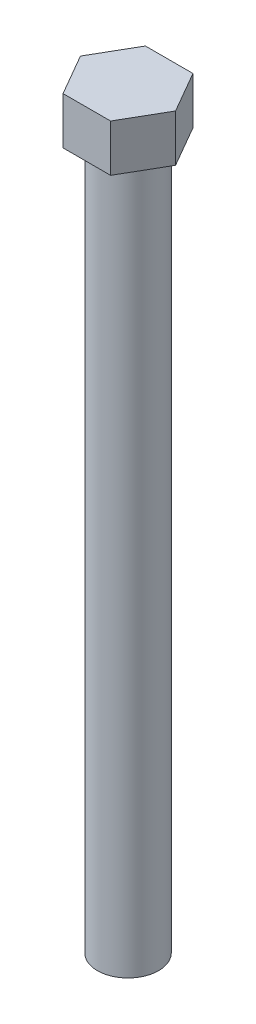
ISO-10303-21;
HEADER;
FILE_DESCRIPTION(('STEP AP214'),'2;1');
FILE_NAME('part.step','',(''),(''),'','','');
FILE_SCHEMA(('AUTOMOTIVE_DESIGN { 1 0 10303 214 1 1 1 1 }'));
ENDSEC;
DATA;
#1=APPLICATION_CONTEXT('core data for automotive mechanical design processes');
#2=APPLICATION_PROTOCOL_DEFINITION('international standard','automotive_design',2000,#1);
#3=PRODUCT_CONTEXT('',#1,'mechanical');
#4=PRODUCT('Part','Part','',(#3));
#5=PRODUCT_RELATED_PRODUCT_CATEGORY('part','',(#4));
#6=PRODUCT_DEFINITION_FORMATION('','',#4);
#7=PRODUCT_DEFINITION_CONTEXT('part definition',#1,'design');
#8=PRODUCT_DEFINITION('design','',#6,#7);
#9=PRODUCT_DEFINITION_SHAPE('','',#8);
#10=(LENGTH_UNIT() NAMED_UNIT(*) SI_UNIT(.MILLI.,.METRE.));
#11=(NAMED_UNIT(*) PLANE_ANGLE_UNIT() SI_UNIT($,.RADIAN.));
#12=(NAMED_UNIT(*) SI_UNIT($,.STERADIAN.) SOLID_ANGLE_UNIT());
#13=UNCERTAINTY_MEASURE_WITH_UNIT(LENGTH_MEASURE(1.E-05),#10,'distance_accuracy_value','');
#14=(GEOMETRIC_REPRESENTATION_CONTEXT(3) GLOBAL_UNCERTAINTY_ASSIGNED_CONTEXT((#13)) GLOBAL_UNIT_ASSIGNED_CONTEXT((#10,
#11,#12)) REPRESENTATION_CONTEXT('',''));
#15=CARTESIAN_POINT('',(0.,0.,0.));
#16=DIRECTION('',(0.,0.,1.));
#17=DIRECTION('',(1.,0.,0.));
#18=AXIS2_PLACEMENT_3D('',#15,#16,#17);
#19=CARTESIAN_POINT('',(0.,-3.,0.));
#20=DIRECTION('',(0.,1.,0.));
#21=DIRECTION('',(0.,0.,1.));
#22=AXIS2_PLACEMENT_3D('',#19,#20,#21);
#23=CYLINDRICAL_SURFACE('',#22,0.13);
#24=CARTESIAN_POINT('',(0.,-3.,0.));
#25=DIRECTION('',(0.,1.,0.));
#26=DIRECTION('',(0.,0.,1.));
#27=AXIS2_PLACEMENT_3D('',#24,#25,#26);
#28=CIRCLE('',#27,0.13);
#29=CARTESIAN_POINT('',(0.,-3.,0.13));
#30=VERTEX_POINT('',#29);
#31=EDGE_CURVE('E11',#30,#30,#28,.T.);
#32=ORIENTED_EDGE('',*,*,#31,.T.);
#33=EDGE_LOOP('',(#32));
#34=FACE_BOUND('',#33,.T.);
#35=CARTESIAN_POINT('',(0.,0.,0.));
#36=DIRECTION('',(0.,1.,0.));
#37=DIRECTION('',(0.,0.,1.));
#38=AXIS2_PLACEMENT_3D('',#35,#36,#37);
#39=CIRCLE('',#38,0.13);
#40=CARTESIAN_POINT('',(0.,0.,0.13));
#41=VERTEX_POINT('',#40);
#42=EDGE_CURVE('E36',#41,#41,#39,.T.);
#43=ORIENTED_EDGE('',*,*,#42,.F.);
#44=EDGE_LOOP('',(#43));
#45=FACE_BOUND('',#44,.T.);
#46=ADVANCED_FACE('F33',(#34,#45),#23,.T.);
#47=CARTESIAN_POINT('',(0.,-3.,0.));
#48=DIRECTION('',(0.,1.,0.));
#49=DIRECTION('',(0.,0.,1.));
#50=AXIS2_PLACEMENT_3D('',#47,#48,#49);
#51=PLANE('',#50);
#52=ORIENTED_EDGE('',*,*,#31,.F.);
#53=EDGE_LOOP('',(#52));
#54=FACE_BOUND('',#53,.T.);
#55=ADVANCED_FACE('F144',(#54),#51,.F.);
#56=CARTESIAN_POINT('',(-0.151554445662277,0.2,0.0875));
#57=DIRECTION('',(0.866025403784439,0.,-0.5));
#58=DIRECTION('',(-0.5,0.,-0.866025403784439));
#59=AXIS2_PLACEMENT_3D('',#56,#57,#58);
#60=PLANE('',#59);
#61=DIRECTION('',(0.5,0.,0.866025403784439));
#62=VECTOR('',#61,1.);
#63=CARTESIAN_POINT('',(-0.151554445662277,0.,0.0875));
#64=LINE('',#63,#62);
#65=CARTESIAN_POINT('',(-0.202072594216369,0.,0.));
#66=VERTEX_POINT('',#65);
#67=CARTESIAN_POINT('',(-0.101036297108185,0.,0.175));
#68=VERTEX_POINT('',#67);
#69=EDGE_CURVE('E118',#66,#68,#64,.T.);
#70=ORIENTED_EDGE('',*,*,#69,.T.);
#71=DIRECTION('',(0.,-1.,0.));
#72=VECTOR('',#71,1.);
#73=CARTESIAN_POINT('',(-0.101036297108185,0.2,0.175));
#74=LINE('',#73,#72);
#75=CARTESIAN_POINT('',(-0.101036297108185,0.2,0.175));
#76=VERTEX_POINT('',#75);
#77=EDGE_CURVE('E135',#76,#68,#74,.T.);
#78=ORIENTED_EDGE('',*,*,#77,.F.);
#79=DIRECTION('',(0.5,0.,0.866025403784439));
#80=VECTOR('',#79,1.);
#81=CARTESIAN_POINT('',(-0.151554445662277,0.2,0.0875));
#82=LINE('',#81,#80);
#83=CARTESIAN_POINT('',(-0.202072594216369,0.2,0.));
#84=VERTEX_POINT('',#83);
#85=EDGE_CURVE('E128',#84,#76,#82,.T.);
#86=ORIENTED_EDGE('',*,*,#85,.F.);
#87=DIRECTION('',(0.,-1.,0.));
#88=VECTOR('',#87,1.);
#89=CARTESIAN_POINT('',(-0.202072594216369,0.2,0.));
#90=LINE('',#89,#88);
#91=EDGE_CURVE('E114',#84,#66,#90,.T.);
#92=ORIENTED_EDGE('',*,*,#91,.T.);
#93=EDGE_LOOP('',(#70,#78,#86,#92));
#94=FACE_BOUND('',#93,.T.);
#95=ADVANCED_FACE('F149',(#94),#60,.F.);
#96=CARTESIAN_POINT('',(0.,0.2,0.175));
#97=DIRECTION('',(0.,0.,-1.));
#98=DIRECTION('',(-1.,0.,0.));
#99=AXIS2_PLACEMENT_3D('',#96,#97,#98);
#100=PLANE('',#99);
#101=DIRECTION('',(1.,0.,0.));
#102=VECTOR('',#101,1.);
#103=CARTESIAN_POINT('',(0.,0.,0.175));
#104=LINE('',#103,#102);
#105=CARTESIAN_POINT('',(0.101036297108185,0.,0.175));
#106=VERTEX_POINT('',#105);
#107=EDGE_CURVE('E121',#68,#106,#104,.T.);
#108=ORIENTED_EDGE('',*,*,#107,.T.);
#109=DIRECTION('',(0.,-1.,0.));
#110=VECTOR('',#109,1.);
#111=CARTESIAN_POINT('',(0.101036297108185,0.2,0.175));
#112=LINE('',#111,#110);
#113=CARTESIAN_POINT('',(0.101036297108185,0.2,0.175));
#114=VERTEX_POINT('',#113);
#115=EDGE_CURVE('E132',#114,#106,#112,.T.);
#116=ORIENTED_EDGE('',*,*,#115,.F.);
#117=DIRECTION('',(1.,0.,0.));
#118=VECTOR('',#117,1.);
#119=CARTESIAN_POINT('',(0.,0.2,0.175));
#120=LINE('',#119,#118);
#121=EDGE_CURVE('E87',#76,#114,#120,.T.);
#122=ORIENTED_EDGE('',*,*,#121,.F.);
#123=ORIENTED_EDGE('',*,*,#77,.T.);
#124=EDGE_LOOP('',(#108,#116,#122,#123));
#125=FACE_BOUND('',#124,.T.);
#126=ADVANCED_FACE('F155',(#125),#100,.F.);
#127=CARTESIAN_POINT('',(0.151554445662277,0.2,0.0875));
#128=DIRECTION('',(-0.866025403784439,0.,-0.5));
#129=DIRECTION('',(-0.5,0.,0.866025403784439));
#130=AXIS2_PLACEMENT_3D('',#127,#128,#129);
#131=PLANE('',#130);
#132=DIRECTION('',(0.5,0.,-0.866025403784439));
#133=VECTOR('',#132,1.);
#134=CARTESIAN_POINT('',(0.151554445662277,0.,0.0875));
#135=LINE('',#134,#133);
#136=CARTESIAN_POINT('',(0.202072594216369,0.,0.));
#137=VERTEX_POINT('',#136);
#138=EDGE_CURVE('E123',#106,#137,#135,.T.);
#139=ORIENTED_EDGE('',*,*,#138,.T.);
#140=DIRECTION('',(0.,-1.,0.));
#141=VECTOR('',#140,1.);
#142=CARTESIAN_POINT('',(0.202072594216369,0.2,0.));
#143=LINE('',#142,#141);
#144=CARTESIAN_POINT('',(0.202072594216369,0.2,0.));
#145=VERTEX_POINT('',#144);
#146=EDGE_CURVE('E109',#145,#137,#143,.T.);
#147=ORIENTED_EDGE('',*,*,#146,.F.);
#148=DIRECTION('',(0.5,0.,-0.866025403784439));
#149=VECTOR('',#148,1.);
#150=CARTESIAN_POINT('',(0.151554445662277,0.2,0.0875));
#151=LINE('',#150,#149);
#152=EDGE_CURVE('E100',#114,#145,#151,.T.);
#153=ORIENTED_EDGE('',*,*,#152,.F.);
#154=ORIENTED_EDGE('',*,*,#115,.T.);
#155=EDGE_LOOP('',(#139,#147,#153,#154));
#156=FACE_BOUND('',#155,.T.);
#157=ADVANCED_FACE('F161',(#156),#131,.F.);
#158=CARTESIAN_POINT('',(0.151554445662277,0.2,-0.0875));
#159=DIRECTION('',(-0.866025403784438,0.,0.5));
#160=DIRECTION('',(0.5,0.,0.866025403784438));
#161=AXIS2_PLACEMENT_3D('',#158,#159,#160);
#162=PLANE('',#161);
#163=DIRECTION('',(-0.5,0.,-0.866025403784438));
#164=VECTOR('',#163,1.);
#165=CARTESIAN_POINT('',(0.151554445662277,0.,-0.0875));
#166=LINE('',#165,#164);
#167=CARTESIAN_POINT('',(0.101036297108184,0.,-0.175));
#168=VERTEX_POINT('',#167);
#169=EDGE_CURVE('E108',#137,#168,#166,.T.);
#170=ORIENTED_EDGE('',*,*,#169,.T.);
#171=DIRECTION('',(0.,-1.,0.));
#172=VECTOR('',#171,1.);
#173=CARTESIAN_POINT('',(0.101036297108184,0.2,-0.175));
#174=LINE('',#173,#172);
#175=CARTESIAN_POINT('',(0.101036297108184,0.2,-0.175));
#176=VERTEX_POINT('',#175);
#177=EDGE_CURVE('E105',#176,#168,#174,.T.);
#178=ORIENTED_EDGE('',*,*,#177,.F.);
#179=DIRECTION('',(-0.5,0.,-0.866025403784438));
#180=VECTOR('',#179,1.);
#181=CARTESIAN_POINT('',(0.151554445662277,0.2,-0.0875));
#182=LINE('',#181,#180);
#183=EDGE_CURVE('E94',#145,#176,#182,.T.);
#184=ORIENTED_EDGE('',*,*,#183,.F.);
#185=ORIENTED_EDGE('',*,*,#146,.T.);
#186=EDGE_LOOP('',(#170,#178,#184,#185));
#187=FACE_BOUND('',#186,.T.);
#188=ADVANCED_FACE('F106',(#187),#162,.F.);
#189=CARTESIAN_POINT('',(0.,0.2,-0.175));
#190=DIRECTION('',(0.,0.,1.));
#191=DIRECTION('',(1.,0.,0.));
#192=AXIS2_PLACEMENT_3D('',#189,#190,#191);
#193=PLANE('',#192);
#194=DIRECTION('',(-1.,0.,0.));
#195=VECTOR('',#194,1.);
#196=CARTESIAN_POINT('',(0.,0.,-0.175));
#197=LINE('',#196,#195);
#198=CARTESIAN_POINT('',(-0.101036297108185,0.,-0.175));
#199=VERTEX_POINT('',#198);
#200=EDGE_CURVE('E72',#168,#199,#197,.T.);
#201=ORIENTED_EDGE('',*,*,#200,.T.);
#202=DIRECTION('',(0.,-1.,0.));
#203=VECTOR('',#202,1.);
#204=CARTESIAN_POINT('',(-0.101036297108185,0.2,-0.175));
#205=LINE('',#204,#203);
#206=CARTESIAN_POINT('',(-0.101036297108185,0.2,-0.175));
#207=VERTEX_POINT('',#206);
#208=EDGE_CURVE('E110',#207,#199,#205,.T.);
#209=ORIENTED_EDGE('',*,*,#208,.F.);
#210=DIRECTION('',(-1.,0.,0.));
#211=VECTOR('',#210,1.);
#212=CARTESIAN_POINT('',(0.,0.2,-0.175));
#213=LINE('',#212,#211);
#214=EDGE_CURVE('E98',#176,#207,#213,.T.);
#215=ORIENTED_EDGE('',*,*,#214,.F.);
#216=ORIENTED_EDGE('',*,*,#177,.T.);
#217=EDGE_LOOP('',(#201,#209,#215,#216));
#218=FACE_BOUND('',#217,.T.);
#219=ADVANCED_FACE('F112',(#218),#193,.F.);
#220=CARTESIAN_POINT('',(-0.151554445662277,0.2,-0.0875));
#221=DIRECTION('',(0.866025403784439,0.,0.5));
#222=DIRECTION('',(0.5,0.,-0.866025403784439));
#223=AXIS2_PLACEMENT_3D('',#220,#221,#222);
#224=PLANE('',#223);
#225=DIRECTION('',(-0.5,0.,0.866025403784439));
#226=VECTOR('',#225,1.);
#227=CARTESIAN_POINT('',(-0.151554445662277,0.,-0.0875));
#228=LINE('',#227,#226);
#229=EDGE_CURVE('E78',#199,#66,#228,.T.);
#230=ORIENTED_EDGE('',*,*,#229,.T.);
#231=ORIENTED_EDGE('',*,*,#91,.F.);
#232=DIRECTION('',(-0.5,0.,0.866025403784439));
#233=VECTOR('',#232,1.);
#234=CARTESIAN_POINT('',(-0.151554445662277,0.2,-0.0875));
#235=LINE('',#234,#233);
#236=EDGE_CURVE('E49',#207,#84,#235,.T.);
#237=ORIENTED_EDGE('',*,*,#236,.F.);
#238=ORIENTED_EDGE('',*,*,#208,.T.);
#239=EDGE_LOOP('',(#230,#231,#237,#238));
#240=FACE_BOUND('',#239,.T.);
#241=ADVANCED_FACE('F169',(#240),#224,.F.);
#242=CARTESIAN_POINT('',(0.,0.2,0.));
#243=DIRECTION('',(0.,1.,0.));
#244=DIRECTION('',(0.,0.,1.));
#245=AXIS2_PLACEMENT_3D('',#242,#243,#244);
#246=PLANE('',#245);
#247=ORIENTED_EDGE('',*,*,#85,.T.);
#248=ORIENTED_EDGE('',*,*,#121,.T.);
#249=ORIENTED_EDGE('',*,*,#152,.T.);
#250=ORIENTED_EDGE('',*,*,#183,.T.);
#251=ORIENTED_EDGE('',*,*,#214,.T.);
#252=ORIENTED_EDGE('',*,*,#236,.T.);
#253=EDGE_LOOP('',(#247,#248,#249,#250,#251,#252));
#254=FACE_BOUND('',#253,.T.);
#255=ADVANCED_FACE('F96',(#254),#246,.T.);
#256=CARTESIAN_POINT('',(0.,0.,0.));
#257=DIRECTION('',(0.,1.,0.));
#258=DIRECTION('',(0.,0.,1.));
#259=AXIS2_PLACEMENT_3D('',#256,#257,#258);
#260=PLANE('',#259);
#261=ORIENTED_EDGE('',*,*,#42,.T.);
#262=EDGE_LOOP('',(#261));
#263=FACE_BOUND('',#262,.T.);
#264=ORIENTED_EDGE('',*,*,#69,.F.);
#265=ORIENTED_EDGE('',*,*,#229,.F.);
#266=ORIENTED_EDGE('',*,*,#200,.F.);
#267=ORIENTED_EDGE('',*,*,#169,.F.);
#268=ORIENTED_EDGE('',*,*,#138,.F.);
#269=ORIENTED_EDGE('',*,*,#107,.F.);
#270=EDGE_LOOP('',(#264,#265,#266,#267,#268,#269));
#271=FACE_BOUND('',#270,.T.);
#272=ADVANCED_FACE('F140',(#263,#271),#260,.F.);
#273=CLOSED_SHELL('',(#46,#55,#95,#126,#157,#188,#219,#241,#255,#272));
#274=MANIFOLD_SOLID_BREP('B2',#273);
#275=ADVANCED_BREP_SHAPE_REPRESENTATION('',(#18,#274),#14);
#276=SHAPE_DEFINITION_REPRESENTATION(#9,#275);
ENDSEC;
END-ISO-10303-21;
